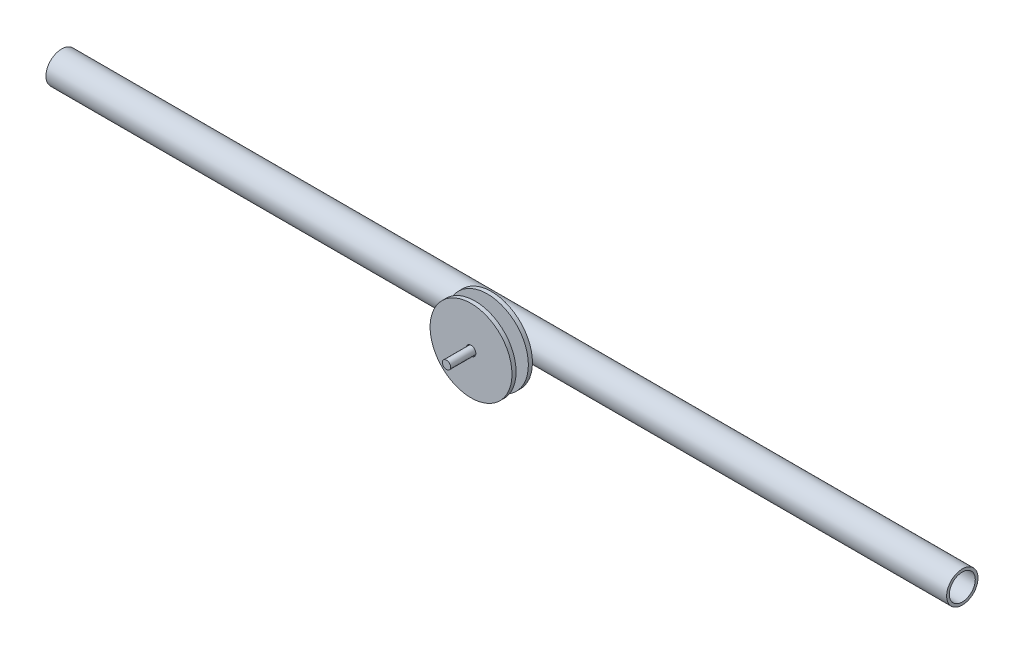
ISO-10303-21;
HEADER;
FILE_DESCRIPTION(('STEP AP214'),'2;1');
FILE_NAME('part.step','',(''),(''),'','','');
FILE_SCHEMA(('AUTOMOTIVE_DESIGN { 1 0 10303 214 1 1 1 1 }'));
ENDSEC;
DATA;
#1=APPLICATION_CONTEXT('core data for automotive mechanical design processes');
#2=APPLICATION_PROTOCOL_DEFINITION('international standard','automotive_design',2000,#1);
#3=PRODUCT_CONTEXT('',#1,'mechanical');
#4=PRODUCT('Part','Part','',(#3));
#5=PRODUCT_RELATED_PRODUCT_CATEGORY('part','',(#4));
#6=PRODUCT_DEFINITION_FORMATION('','',#4);
#7=PRODUCT_DEFINITION_CONTEXT('part definition',#1,'design');
#8=PRODUCT_DEFINITION('design','',#6,#7);
#9=PRODUCT_DEFINITION_SHAPE('','',#8);
#10=(LENGTH_UNIT() NAMED_UNIT(*) SI_UNIT(.MILLI.,.METRE.));
#11=(NAMED_UNIT(*) PLANE_ANGLE_UNIT() SI_UNIT($,.RADIAN.));
#12=(NAMED_UNIT(*) SI_UNIT($,.STERADIAN.) SOLID_ANGLE_UNIT());
#13=UNCERTAINTY_MEASURE_WITH_UNIT(LENGTH_MEASURE(1.E-05),#10,'distance_accuracy_value','');
#14=(GEOMETRIC_REPRESENTATION_CONTEXT(3) GLOBAL_UNCERTAINTY_ASSIGNED_CONTEXT((#13)) GLOBAL_UNIT_ASSIGNED_CONTEXT((#10,
#11,#12)) REPRESENTATION_CONTEXT('',''));
#15=CARTESIAN_POINT('',(0.,0.,0.));
#16=DIRECTION('',(0.,0.,1.));
#17=DIRECTION('',(1.,0.,0.));
#18=AXIS2_PLACEMENT_3D('',#15,#16,#17);
#19=CARTESIAN_POINT('',(0.,0.,7.5));
#20=DIRECTION('',(0.,0.,1.));
#21=DIRECTION('',(1.,0.,0.));
#22=AXIS2_PLACEMENT_3D('',#19,#20,#21);
#23=CYLINDRICAL_SURFACE('',#22,15.);
#24=CARTESIAN_POINT('',(0.,0.,7.5));
#25=DIRECTION('',(0.,0.,1.));
#26=DIRECTION('',(1.,0.,0.));
#27=AXIS2_PLACEMENT_3D('',#24,#25,#26);
#28=CIRCLE('',#27,15.);
#29=CARTESIAN_POINT('',(15.,0.,7.5));
#30=VERTEX_POINT('',#29);
#31=EDGE_CURVE('E12',#30,#30,#28,.T.);
#32=ORIENTED_EDGE('',*,*,#31,.T.);
#33=EDGE_LOOP('',(#32));
#34=FACE_BOUND('',#33,.T.);
#35=CARTESIAN_POINT('',(0.,0.,9.));
#36=DIRECTION('',(0.,0.,1.));
#37=DIRECTION('',(1.,0.,0.));
#38=AXIS2_PLACEMENT_3D('',#35,#36,#37);
#39=CIRCLE('',#38,15.);
#40=CARTESIAN_POINT('',(15.,0.,9.));
#41=VERTEX_POINT('',#40);
#42=EDGE_CURVE('E52',#41,#41,#39,.T.);
#43=ORIENTED_EDGE('',*,*,#42,.F.);
#44=EDGE_LOOP('',(#43));
#45=FACE_BOUND('',#44,.T.);
#46=ADVANCED_FACE('F49',(#34,#45),#23,.T.);
#47=CARTESIAN_POINT('',(0.,0.,7.5));
#48=DIRECTION('',(0.,0.,1.));
#49=DIRECTION('',(1.,0.,0.));
#50=AXIS2_PLACEMENT_3D('',#47,#48,#49);
#51=PLANE('',#50);
#52=CARTESIAN_POINT('',(0.,0.,7.5));
#53=DIRECTION('',(0.,0.,1.));
#54=DIRECTION('',(1.,0.,0.));
#55=AXIS2_PLACEMENT_3D('',#52,#53,#54);
#56=CIRCLE('',#55,1.75);
#57=CARTESIAN_POINT('',(1.75,0.,7.5));
#58=VERTEX_POINT('',#57);
#59=EDGE_CURVE('E59',#58,#58,#56,.T.);
#60=ORIENTED_EDGE('',*,*,#59,.T.);
#61=EDGE_LOOP('',(#60));
#62=FACE_BOUND('',#61,.T.);
#63=ORIENTED_EDGE('',*,*,#31,.F.);
#64=EDGE_LOOP('',(#63));
#65=FACE_BOUND('',#64,.T.);
#66=ADVANCED_FACE('F67',(#62,#65),#51,.F.);
#67=CARTESIAN_POINT('',(0.,0.,9.));
#68=DIRECTION('',(0.,0.,1.));
#69=DIRECTION('',(1.,0.,0.));
#70=AXIS2_PLACEMENT_3D('',#67,#68,#69);
#71=PLANE('',#70);
#72=CARTESIAN_POINT('',(0.,0.,9.));
#73=DIRECTION('',(0.,0.,1.));
#74=DIRECTION('',(1.,0.,0.));
#75=AXIS2_PLACEMENT_3D('',#72,#73,#74);
#76=CIRCLE('',#75,1.75);
#77=CARTESIAN_POINT('',(1.75,0.,9.));
#78=VERTEX_POINT('',#77);
#79=EDGE_CURVE('E61',#78,#78,#76,.T.);
#80=ORIENTED_EDGE('',*,*,#79,.F.);
#81=EDGE_LOOP('',(#80));
#82=FACE_BOUND('',#81,.T.);
#83=ORIENTED_EDGE('',*,*,#42,.T.);
#84=EDGE_LOOP('',(#83));
#85=FACE_BOUND('',#84,.T.);
#86=ADVANCED_FACE('F73',(#82,#85),#71,.T.);
#87=CARTESIAN_POINT('',(0.,0.,7.5));
#88=DIRECTION('',(0.,0.,1.));
#89=DIRECTION('',(1.,0.,0.));
#90=AXIS2_PLACEMENT_3D('',#87,#88,#89);
#91=CYLINDRICAL_SURFACE('',#90,1.75);
#92=ORIENTED_EDGE('',*,*,#59,.F.);
#93=EDGE_LOOP('',(#92));
#94=FACE_BOUND('',#93,.T.);
#95=ORIENTED_EDGE('',*,*,#79,.T.);
#96=EDGE_LOOP('',(#95));
#97=FACE_BOUND('',#96,.T.);
#98=ADVANCED_FACE('F70',(#94,#97),#91,.F.);
#99=CLOSED_SHELL('',(#46,#66,#86,#98));
#100=MANIFOLD_SOLID_BREP('B2',#99);
#101=CARTESIAN_POINT('',(0.,0.,13.5));
#102=DIRECTION('',(0.,0.,1.));
#103=DIRECTION('',(1.,0.,0.));
#104=AXIS2_PLACEMENT_3D('',#101,#102,#103);
#105=CYLINDRICAL_SURFACE('',#104,15.);
#106=CARTESIAN_POINT('',(0.,0.,13.5));
#107=DIRECTION('',(0.,0.,1.));
#108=DIRECTION('',(1.,0.,0.));
#109=AXIS2_PLACEMENT_3D('',#106,#107,#108);
#110=CIRCLE('',#109,15.);
#111=CARTESIAN_POINT('',(15.,0.,13.5));
#112=VERTEX_POINT('',#111);
#113=EDGE_CURVE('E48',#112,#112,#110,.T.);
#114=ORIENTED_EDGE('',*,*,#113,.T.);
#115=EDGE_LOOP('',(#114));
#116=FACE_BOUND('',#115,.T.);
#117=CARTESIAN_POINT('',(0.,0.,15.));
#118=DIRECTION('',(0.,0.,1.));
#119=DIRECTION('',(1.,0.,0.));
#120=AXIS2_PLACEMENT_3D('',#117,#118,#119);
#121=CIRCLE('',#120,15.);
#122=CARTESIAN_POINT('',(15.,0.,15.));
#123=VERTEX_POINT('',#122);
#124=EDGE_CURVE('E121',#123,#123,#121,.T.);
#125=ORIENTED_EDGE('',*,*,#124,.F.);
#126=EDGE_LOOP('',(#125));
#127=FACE_BOUND('',#126,.T.);
#128=ADVANCED_FACE('F118',(#116,#127),#105,.T.);
#129=CARTESIAN_POINT('',(0.,0.,13.5));
#130=DIRECTION('',(0.,0.,1.));
#131=DIRECTION('',(1.,0.,0.));
#132=AXIS2_PLACEMENT_3D('',#129,#130,#131);
#133=PLANE('',#132);
#134=CARTESIAN_POINT('',(0.,0.,13.5));
#135=DIRECTION('',(0.,0.,1.));
#136=DIRECTION('',(1.,0.,0.));
#137=AXIS2_PLACEMENT_3D('',#134,#135,#136);
#138=CIRCLE('',#137,1.75);
#139=CARTESIAN_POINT('',(1.75,0.,13.5));
#140=VERTEX_POINT('',#139);
#141=EDGE_CURVE('E128',#140,#140,#138,.T.);
#142=ORIENTED_EDGE('',*,*,#141,.T.);
#143=EDGE_LOOP('',(#142));
#144=FACE_BOUND('',#143,.T.);
#145=ORIENTED_EDGE('',*,*,#113,.F.);
#146=EDGE_LOOP('',(#145));
#147=FACE_BOUND('',#146,.T.);
#148=ADVANCED_FACE('F136',(#144,#147),#133,.F.);
#149=CARTESIAN_POINT('',(0.,0.,15.));
#150=DIRECTION('',(0.,0.,1.));
#151=DIRECTION('',(1.,0.,0.));
#152=AXIS2_PLACEMENT_3D('',#149,#150,#151);
#153=PLANE('',#152);
#154=CARTESIAN_POINT('',(0.,0.,15.));
#155=DIRECTION('',(0.,0.,1.));
#156=DIRECTION('',(1.,0.,0.));
#157=AXIS2_PLACEMENT_3D('',#154,#155,#156);
#158=CIRCLE('',#157,1.75);
#159=CARTESIAN_POINT('',(1.75,0.,15.));
#160=VERTEX_POINT('',#159);
#161=EDGE_CURVE('E130',#160,#160,#158,.T.);
#162=ORIENTED_EDGE('',*,*,#161,.F.);
#163=EDGE_LOOP('',(#162));
#164=FACE_BOUND('',#163,.T.);
#165=ORIENTED_EDGE('',*,*,#124,.T.);
#166=EDGE_LOOP('',(#165));
#167=FACE_BOUND('',#166,.T.);
#168=ADVANCED_FACE('F142',(#164,#167),#153,.T.);
#169=CARTESIAN_POINT('',(0.,0.,13.5));
#170=DIRECTION('',(0.,0.,1.));
#171=DIRECTION('',(1.,0.,0.));
#172=AXIS2_PLACEMENT_3D('',#169,#170,#171);
#173=CYLINDRICAL_SURFACE('',#172,1.75);
#174=ORIENTED_EDGE('',*,*,#141,.F.);
#175=EDGE_LOOP('',(#174));
#176=FACE_BOUND('',#175,.T.);
#177=ORIENTED_EDGE('',*,*,#161,.T.);
#178=EDGE_LOOP('',(#177));
#179=FACE_BOUND('',#178,.T.);
#180=ADVANCED_FACE('F139',(#176,#179),#173,.F.);
#181=CLOSED_SHELL('',(#128,#148,#168,#180));
#182=MANIFOLD_SOLID_BREP('B7',#181);
#183=CARTESIAN_POINT('',(0.,0.,24.));
#184=DIRECTION('',(0.,0.,-1.));
#185=DIRECTION('',(-1.,0.,0.));
#186=AXIS2_PLACEMENT_3D('',#183,#184,#185);
#187=CYLINDRICAL_SURFACE('',#186,1.5);
#188=CARTESIAN_POINT('',(0.,0.,24.));
#189=DIRECTION('',(0.,0.,1.));
#190=DIRECTION('',(1.,0.,0.));
#191=AXIS2_PLACEMENT_3D('',#188,#189,#190);
#192=CIRCLE('',#191,1.5);
#193=CARTESIAN_POINT('',(1.5,0.,24.));
#194=VERTEX_POINT('',#193);
#195=EDGE_CURVE('E117',#194,#194,#192,.T.);
#196=ORIENTED_EDGE('',*,*,#195,.F.);
#197=EDGE_LOOP('',(#196));
#198=FACE_BOUND('',#197,.T.);
#199=CARTESIAN_POINT('',(0.,0.,-6.));
#200=DIRECTION('',(0.,0.,1.));
#201=DIRECTION('',(1.,0.,0.));
#202=AXIS2_PLACEMENT_3D('',#199,#200,#201);
#203=CIRCLE('',#202,1.5);
#204=CARTESIAN_POINT('',(1.5,0.,-6.));
#205=VERTEX_POINT('',#204);
#206=EDGE_CURVE('E189',#205,#205,#203,.T.);
#207=ORIENTED_EDGE('',*,*,#206,.T.);
#208=EDGE_LOOP('',(#207));
#209=FACE_BOUND('',#208,.T.);
#210=ADVANCED_FACE('F186',(#198,#209),#187,.T.);
#211=CARTESIAN_POINT('',(0.,0.,24.));
#212=DIRECTION('',(0.,0.,1.));
#213=DIRECTION('',(1.,0.,0.));
#214=AXIS2_PLACEMENT_3D('',#211,#212,#213);
#215=PLANE('',#214);
#216=ORIENTED_EDGE('',*,*,#195,.T.);
#217=EDGE_LOOP('',(#216));
#218=FACE_BOUND('',#217,.T.);
#219=ADVANCED_FACE('F201',(#218),#215,.T.);
#220=CARTESIAN_POINT('',(0.,0.,-6.));
#221=DIRECTION('',(0.,0.,1.));
#222=DIRECTION('',(1.,0.,0.));
#223=AXIS2_PLACEMENT_3D('',#220,#221,#222);
#224=PLANE('',#223);
#225=ORIENTED_EDGE('',*,*,#206,.F.);
#226=EDGE_LOOP('',(#225));
#227=FACE_BOUND('',#226,.T.);
#228=ADVANCED_FACE('F199',(#227),#224,.F.);
#229=CLOSED_SHELL('',(#210,#219,#228));
#230=MANIFOLD_SOLID_BREP('B43',#229);
#231=CARTESIAN_POINT('',(165.,0.,0.));
#232=DIRECTION('',(1.,0.,0.));
#233=DIRECTION('',(0.,0.,-1.));
#234=AXIS2_PLACEMENT_3D('',#231,#232,#233);
#235=PLANE('',#234);
#236=CARTESIAN_POINT('',(165.,0.,0.));
#237=DIRECTION('',(1.,0.,0.));
#238=DIRECTION('',(0.,0.,-1.));
#239=AXIS2_PLACEMENT_3D('',#236,#237,#238);
#240=CIRCLE('',#239,5.75);
#241=CARTESIAN_POINT('',(165.,0.,-5.75));
#242=VERTEX_POINT('',#241);
#243=EDGE_CURVE('E185',#242,#242,#240,.T.);
#244=ORIENTED_EDGE('',*,*,#243,.T.);
#245=EDGE_LOOP('',(#244));
#246=FACE_BOUND('',#245,.T.);
#247=CARTESIAN_POINT('',(165.,0.,0.));
#248=DIRECTION('',(1.,0.,0.));
#249=DIRECTION('',(0.,0.,-1.));
#250=AXIS2_PLACEMENT_3D('',#247,#248,#249);
#251=CIRCLE('',#250,4.75);
#252=CARTESIAN_POINT('',(165.,0.,-4.75));
#253=VERTEX_POINT('',#252);
#254=EDGE_CURVE('E238',#253,#253,#251,.T.);
#255=ORIENTED_EDGE('',*,*,#254,.F.);
#256=EDGE_LOOP('',(#255));
#257=FACE_BOUND('',#256,.T.);
#258=ADVANCED_FACE('F227',(#246,#257),#235,.T.);
#259=CARTESIAN_POINT('',(-165.,0.,0.));
#260=DIRECTION('',(1.,0.,0.));
#261=DIRECTION('',(0.,0.,-1.));
#262=AXIS2_PLACEMENT_3D('',#259,#260,#261);
#263=PLANE('',#262);
#264=CARTESIAN_POINT('',(-165.,0.,0.));
#265=DIRECTION('',(1.,0.,0.));
#266=DIRECTION('',(0.,0.,-1.));
#267=AXIS2_PLACEMENT_3D('',#264,#265,#266);
#268=CIRCLE('',#267,5.75);
#269=CARTESIAN_POINT('',(-165.,0.,-5.75));
#270=VERTEX_POINT('',#269);
#271=EDGE_CURVE('E231',#270,#270,#268,.T.);
#272=ORIENTED_EDGE('',*,*,#271,.F.);
#273=EDGE_LOOP('',(#272));
#274=FACE_BOUND('',#273,.T.);
#275=CARTESIAN_POINT('',(-165.,0.,0.));
#276=DIRECTION('',(1.,0.,0.));
#277=DIRECTION('',(0.,0.,-1.));
#278=AXIS2_PLACEMENT_3D('',#275,#276,#277);
#279=CIRCLE('',#278,4.75);
#280=CARTESIAN_POINT('',(-165.,0.,-4.75));
#281=VERTEX_POINT('',#280);
#282=EDGE_CURVE('E240',#281,#281,#279,.T.);
#283=ORIENTED_EDGE('',*,*,#282,.T.);
#284=EDGE_LOOP('',(#283));
#285=FACE_BOUND('',#284,.T.);
#286=ADVANCED_FACE('F250',(#274,#285),#263,.F.);
#287=CARTESIAN_POINT('',(165.,0.,0.));
#288=DIRECTION('',(-1.,0.,0.));
#289=DIRECTION('',(0.,0.,1.));
#290=AXIS2_PLACEMENT_3D('',#287,#288,#289);
#291=CYLINDRICAL_SURFACE('',#290,5.75);
#292=ORIENTED_EDGE('',*,*,#243,.F.);
#293=EDGE_LOOP('',(#292));
#294=FACE_BOUND('',#293,.T.);
#295=ORIENTED_EDGE('',*,*,#271,.T.);
#296=EDGE_LOOP('',(#295));
#297=FACE_BOUND('',#296,.T.);
#298=ADVANCED_FACE('F229',(#294,#297),#291,.T.);
#299=CARTESIAN_POINT('',(165.,0.,0.));
#300=DIRECTION('',(-1.,0.,0.));
#301=DIRECTION('',(0.,0.,1.));
#302=AXIS2_PLACEMENT_3D('',#299,#300,#301);
#303=CYLINDRICAL_SURFACE('',#302,4.75);
#304=ORIENTED_EDGE('',*,*,#254,.T.);
#305=EDGE_LOOP('',(#304));
#306=FACE_BOUND('',#305,.T.);
#307=ORIENTED_EDGE('',*,*,#282,.F.);
#308=EDGE_LOOP('',(#307));
#309=FACE_BOUND('',#308,.T.);
#310=ADVANCED_FACE('F246',(#306,#309),#303,.F.);
#311=CLOSED_SHELL('',(#258,#286,#298,#310));
#312=MANIFOLD_SOLID_BREP('B112',#311);
#313=ADVANCED_BREP_SHAPE_REPRESENTATION('',(#18,#100,#182,#230,#312),#14);
#314=SHAPE_DEFINITION_REPRESENTATION(#9,#313);
ENDSEC;
END-ISO-10303-21;
